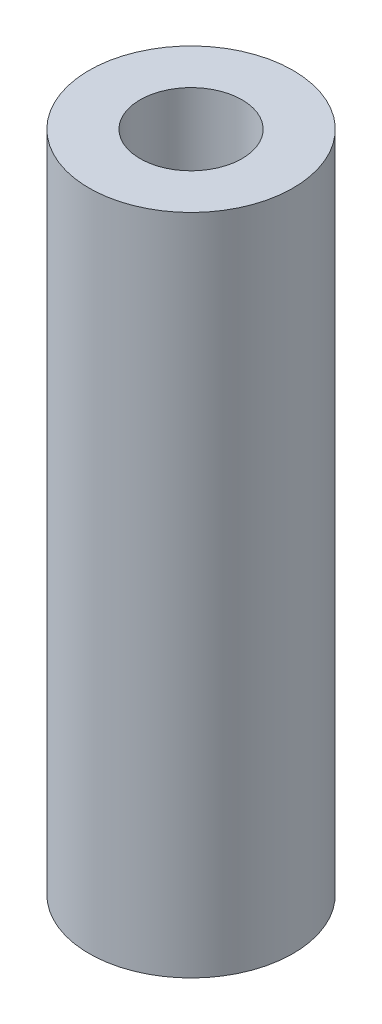
ISO-10303-21;
HEADER;
FILE_DESCRIPTION(('STEP AP214'),'2;1');
FILE_NAME('part.step','',(''),(''),'','','');
FILE_SCHEMA(('AUTOMOTIVE_DESIGN { 1 0 10303 214 1 1 1 1 }'));
ENDSEC;
DATA;
#1=APPLICATION_CONTEXT('core data for automotive mechanical design processes');
#2=APPLICATION_PROTOCOL_DEFINITION('international standard','automotive_design',2000,#1);
#3=PRODUCT_CONTEXT('',#1,'mechanical');
#4=PRODUCT('Part','Part','',(#3));
#5=PRODUCT_RELATED_PRODUCT_CATEGORY('part','',(#4));
#6=PRODUCT_DEFINITION_FORMATION('','',#4);
#7=PRODUCT_DEFINITION_CONTEXT('part definition',#1,'design');
#8=PRODUCT_DEFINITION('design','',#6,#7);
#9=PRODUCT_DEFINITION_SHAPE('','',#8);
#10=(LENGTH_UNIT() NAMED_UNIT(*) SI_UNIT(.MILLI.,.METRE.));
#11=(NAMED_UNIT(*) PLANE_ANGLE_UNIT() SI_UNIT($,.RADIAN.));
#12=(NAMED_UNIT(*) SI_UNIT($,.STERADIAN.) SOLID_ANGLE_UNIT());
#13=UNCERTAINTY_MEASURE_WITH_UNIT(LENGTH_MEASURE(1.E-05),#10,'distance_accuracy_value','');
#14=(GEOMETRIC_REPRESENTATION_CONTEXT(3) GLOBAL_UNCERTAINTY_ASSIGNED_CONTEXT((#13)) GLOBAL_UNIT_ASSIGNED_CONTEXT((#10,
#11,#12)) REPRESENTATION_CONTEXT('',''));
#15=CARTESIAN_POINT('',(0.,0.,0.));
#16=DIRECTION('',(0.,0.,1.));
#17=DIRECTION('',(1.,0.,0.));
#18=AXIS2_PLACEMENT_3D('',#15,#16,#17);
#19=CARTESIAN_POINT('',(0.,6.5,0.));
#20=DIRECTION('',(0.,1.,0.));
#21=DIRECTION('',(0.,0.,1.));
#22=AXIS2_PLACEMENT_3D('',#19,#20,#21);
#23=PLANE('',#22);
#24=CARTESIAN_POINT('',(0.,6.5,0.));
#25=DIRECTION('',(0.,1.,0.));
#26=DIRECTION('',(0.,0.,1.));
#27=AXIS2_PLACEMENT_3D('',#24,#25,#26);
#28=CIRCLE('',#27,2.);
#29=CARTESIAN_POINT('',(0.,6.5,-2.));
#30=VERTEX_POINT('',#29);
#31=EDGE_CURVE('E10',#30,#30,#28,.T.);
#32=ORIENTED_EDGE('',*,*,#31,.T.);
#33=EDGE_LOOP('',(#32));
#34=FACE_BOUND('',#33,.T.);
#35=CARTESIAN_POINT('',(0.,6.5,0.));
#36=DIRECTION('',(0.,1.,0.));
#37=DIRECTION('',(0.,0.,1.));
#38=AXIS2_PLACEMENT_3D('',#35,#36,#37);
#39=CIRCLE('',#38,1.);
#40=CARTESIAN_POINT('',(0.,6.5,-1.));
#41=VERTEX_POINT('',#40);
#42=EDGE_CURVE('E42',#41,#41,#39,.T.);
#43=ORIENTED_EDGE('',*,*,#42,.F.);
#44=EDGE_LOOP('',(#43));
#45=FACE_BOUND('',#44,.T.);
#46=ADVANCED_FACE('F31',(#34,#45),#23,.T.);
#47=CARTESIAN_POINT('',(0.,-6.5,0.));
#48=DIRECTION('',(0.,1.,0.));
#49=DIRECTION('',(0.,0.,1.));
#50=AXIS2_PLACEMENT_3D('',#47,#48,#49);
#51=PLANE('',#50);
#52=CARTESIAN_POINT('',(0.,-6.5,0.));
#53=DIRECTION('',(0.,1.,0.));
#54=DIRECTION('',(0.,0.,1.));
#55=AXIS2_PLACEMENT_3D('',#52,#53,#54);
#56=CIRCLE('',#55,2.);
#57=CARTESIAN_POINT('',(0.,-6.5,-2.));
#58=VERTEX_POINT('',#57);
#59=EDGE_CURVE('E35',#58,#58,#56,.T.);
#60=ORIENTED_EDGE('',*,*,#59,.F.);
#61=EDGE_LOOP('',(#60));
#62=FACE_BOUND('',#61,.T.);
#63=CARTESIAN_POINT('',(0.,-6.5,0.));
#64=DIRECTION('',(0.,1.,0.));
#65=DIRECTION('',(0.,0.,1.));
#66=AXIS2_PLACEMENT_3D('',#63,#64,#65);
#67=CIRCLE('',#66,1.);
#68=CARTESIAN_POINT('',(0.,-6.5,-1.));
#69=VERTEX_POINT('',#68);
#70=EDGE_CURVE('E44',#69,#69,#67,.T.);
#71=ORIENTED_EDGE('',*,*,#70,.T.);
#72=EDGE_LOOP('',(#71));
#73=FACE_BOUND('',#72,.T.);
#74=ADVANCED_FACE('F54',(#62,#73),#51,.F.);
#75=CARTESIAN_POINT('',(0.,6.5,0.));
#76=DIRECTION('',(0.,-1.,0.));
#77=DIRECTION('',(0.,0.,-1.));
#78=AXIS2_PLACEMENT_3D('',#75,#76,#77);
#79=CYLINDRICAL_SURFACE('',#78,2.);
#80=CARTESIAN_POINT('',(0.,6.5,-2.));
#81=CARTESIAN_POINT('',(0.,6.36458333333333,-2.));
#82=CARTESIAN_POINT('',(0.,6.22916666666667,-2.));
#83=CARTESIAN_POINT('',(0.,5.95833333333333,-2.));
#84=CARTESIAN_POINT('',(0.,5.82291666666667,-2.));
#85=CARTESIAN_POINT('',(0.,5.55208333333333,-2.));
#86=CARTESIAN_POINT('',(0.,5.41666666666667,-2.));
#87=CARTESIAN_POINT('',(0.,5.14583333333333,-2.));
#88=CARTESIAN_POINT('',(0.,5.01041666666667,-2.));
#89=CARTESIAN_POINT('',(0.,4.73958333333333,-2.));
#90=CARTESIAN_POINT('',(0.,4.60416666666667,-2.));
#91=CARTESIAN_POINT('',(0.,4.33333333333333,-2.));
#92=CARTESIAN_POINT('',(0.,4.19791666666667,-2.));
#93=CARTESIAN_POINT('',(0.,3.92708333333333,-2.));
#94=CARTESIAN_POINT('',(0.,3.79166666666667,-2.));
#95=CARTESIAN_POINT('',(0.,3.52083333333333,-2.));
#96=CARTESIAN_POINT('',(0.,3.38541666666667,-2.));
#97=CARTESIAN_POINT('',(0.,3.11458333333333,-2.));
#98=CARTESIAN_POINT('',(0.,2.97916666666667,-2.));
#99=CARTESIAN_POINT('',(0.,2.70833333333333,-2.));
#100=CARTESIAN_POINT('',(0.,2.57291666666667,-2.));
#101=CARTESIAN_POINT('',(0.,2.30208333333333,-2.));
#102=CARTESIAN_POINT('',(0.,2.16666666666667,-2.));
#103=CARTESIAN_POINT('',(0.,1.89583333333333,-2.));
#104=CARTESIAN_POINT('',(0.,1.76041666666667,-2.));
#105=CARTESIAN_POINT('',(0.,1.48958333333333,-2.));
#106=CARTESIAN_POINT('',(0.,1.35416666666667,-2.));
#107=CARTESIAN_POINT('',(0.,1.08333333333333,-2.));
#108=CARTESIAN_POINT('',(0.,0.947916666666666,-2.));
#109=CARTESIAN_POINT('',(0.,0.677083333333332,-2.));
#110=CARTESIAN_POINT('',(0.,0.541666666666666,-2.));
#111=CARTESIAN_POINT('',(0.,0.270833333333333,-2.));
#112=CARTESIAN_POINT('',(0.,0.135416666666666,-2.));
#113=CARTESIAN_POINT('',(0.,-0.135416666666668,-2.));
#114=CARTESIAN_POINT('',(0.,-0.270833333333334,-2.));
#115=CARTESIAN_POINT('',(0.,-0.541666666666668,-2.));
#116=CARTESIAN_POINT('',(0.,-0.677083333333334,-2.));
#117=CARTESIAN_POINT('',(0.,-0.947916666666667,-2.));
#118=CARTESIAN_POINT('',(0.,-1.08333333333333,-2.));
#119=CARTESIAN_POINT('',(0.,-1.35416666666667,-2.));
#120=CARTESIAN_POINT('',(0.,-1.48958333333333,-2.));
#121=CARTESIAN_POINT('',(0.,-1.76041666666667,-2.));
#122=CARTESIAN_POINT('',(0.,-1.89583333333333,-2.));
#123=CARTESIAN_POINT('',(0.,-2.16666666666667,-2.));
#124=CARTESIAN_POINT('',(0.,-2.30208333333333,-2.));
#125=CARTESIAN_POINT('',(0.,-2.57291666666667,-2.));
#126=CARTESIAN_POINT('',(0.,-2.70833333333333,-2.));
#127=CARTESIAN_POINT('',(0.,-2.97916666666667,-2.));
#128=CARTESIAN_POINT('',(0.,-3.11458333333333,-2.));
#129=CARTESIAN_POINT('',(0.,-3.38541666666667,-2.));
#130=CARTESIAN_POINT('',(0.,-3.52083333333333,-2.));
#131=CARTESIAN_POINT('',(0.,-3.79166666666667,-2.));
#132=CARTESIAN_POINT('',(0.,-3.92708333333333,-2.));
#133=CARTESIAN_POINT('',(0.,-4.19791666666667,-2.));
#134=CARTESIAN_POINT('',(0.,-4.33333333333333,-2.));
#135=CARTESIAN_POINT('',(0.,-4.60416666666667,-2.));
#136=CARTESIAN_POINT('',(0.,-4.73958333333333,-2.));
#137=CARTESIAN_POINT('',(0.,-5.01041666666667,-2.));
#138=CARTESIAN_POINT('',(0.,-5.14583333333333,-2.));
#139=CARTESIAN_POINT('',(0.,-5.41666666666667,-2.));
#140=CARTESIAN_POINT('',(0.,-5.55208333333333,-2.));
#141=CARTESIAN_POINT('',(0.,-5.82291666666667,-2.));
#142=CARTESIAN_POINT('',(0.,-5.95833333333333,-2.));
#143=CARTESIAN_POINT('',(0.,-6.22916666666667,-2.));
#144=CARTESIAN_POINT('',(0.,-6.36458333333333,-2.));
#145=CARTESIAN_POINT('',(0.,-6.5,-2.));
#146=B_SPLINE_CURVE_WITH_KNOTS('',3,(#80,#81,#82,#83,#84,#85,#86,#87,#88,#89,#90,#91,#92,#93,
#94,#95,#96,#97,#98,#99,#100,#101,#102,#103,#104,#105,#106,#107,#108,#109,#110,#111,#112,#113,
#114,#115,#116,#117,#118,#119,#120,#121,#122,#123,#124,#125,#126,#127,#128,#129,#130,#131,#132,
#133,#134,#135,#136,#137,#138,#139,#140,#141,#142,#143,#144,#145),.UNSPECIFIED.,.F.,.F.,(4,2,2,
2,2,2,2,2,2,2,2,2,2,2,2,2,2,2,2,2,2,2,2,2,2,2,2,2,2,2,2,2,4),(0.,0.40625,0.8125,1.21875,1.625,
2.03125,2.4375,2.84375,3.25,3.65625,4.0625,4.46875,4.875,5.28125,5.6875,6.09375,6.5,6.90625,
7.3125,7.71875,8.125,8.53125,8.9375,9.34375,9.75,10.15625,10.5625,10.96875,11.375,11.78125,
12.1875,12.59375,13.),.UNSPECIFIED.);
#147=EDGE_CURVE('BSEAM33',#30,#58,#146,.T.);
#148=ORIENTED_EDGE('',*,*,#31,.F.);
#149=ORIENTED_EDGE('',*,*,#59,.T.);
#150=ORIENTED_EDGE('',*,*,#147,.T.);
#151=ORIENTED_EDGE('',*,*,#147,.F.);
#152=EDGE_LOOP('',(#148,#150,#149,#151));
#153=FACE_BOUND('',#152,.T.);
#154=ADVANCED_FACE('F33',(#153),#79,.T.);
#155=CARTESIAN_POINT('',(0.,6.5,0.));
#156=DIRECTION('',(0.,-1.,0.));
#157=DIRECTION('',(0.,0.,-1.));
#158=AXIS2_PLACEMENT_3D('',#155,#156,#157);
#159=CYLINDRICAL_SURFACE('',#158,1.);
#160=CARTESIAN_POINT('',(0.,6.5,-1.));
#161=CARTESIAN_POINT('',(0.,6.36458333333333,-1.));
#162=CARTESIAN_POINT('',(0.,6.22916666666667,-1.));
#163=CARTESIAN_POINT('',(0.,5.95833333333333,-1.));
#164=CARTESIAN_POINT('',(0.,5.82291666666667,-1.));
#165=CARTESIAN_POINT('',(0.,5.55208333333333,-1.));
#166=CARTESIAN_POINT('',(0.,5.41666666666667,-1.));
#167=CARTESIAN_POINT('',(0.,5.14583333333333,-1.));
#168=CARTESIAN_POINT('',(0.,5.01041666666667,-1.));
#169=CARTESIAN_POINT('',(0.,4.73958333333333,-1.));
#170=CARTESIAN_POINT('',(0.,4.60416666666667,-1.));
#171=CARTESIAN_POINT('',(0.,4.33333333333333,-1.));
#172=CARTESIAN_POINT('',(0.,4.19791666666667,-1.));
#173=CARTESIAN_POINT('',(0.,3.92708333333333,-1.));
#174=CARTESIAN_POINT('',(0.,3.79166666666667,-1.));
#175=CARTESIAN_POINT('',(0.,3.52083333333333,-1.));
#176=CARTESIAN_POINT('',(0.,3.38541666666667,-1.));
#177=CARTESIAN_POINT('',(0.,3.11458333333333,-1.));
#178=CARTESIAN_POINT('',(0.,2.97916666666667,-1.));
#179=CARTESIAN_POINT('',(0.,2.70833333333333,-1.));
#180=CARTESIAN_POINT('',(0.,2.57291666666667,-1.));
#181=CARTESIAN_POINT('',(0.,2.30208333333333,-1.));
#182=CARTESIAN_POINT('',(0.,2.16666666666667,-1.));
#183=CARTESIAN_POINT('',(0.,1.89583333333333,-1.));
#184=CARTESIAN_POINT('',(0.,1.76041666666667,-1.));
#185=CARTESIAN_POINT('',(0.,1.48958333333333,-1.));
#186=CARTESIAN_POINT('',(0.,1.35416666666667,-1.));
#187=CARTESIAN_POINT('',(0.,1.08333333333333,-1.));
#188=CARTESIAN_POINT('',(0.,0.947916666666666,-1.));
#189=CARTESIAN_POINT('',(0.,0.677083333333332,-1.));
#190=CARTESIAN_POINT('',(0.,0.541666666666666,-1.));
#191=CARTESIAN_POINT('',(0.,0.270833333333333,-1.));
#192=CARTESIAN_POINT('',(0.,0.135416666666666,-1.));
#193=CARTESIAN_POINT('',(0.,-0.135416666666668,-1.));
#194=CARTESIAN_POINT('',(0.,-0.270833333333334,-1.));
#195=CARTESIAN_POINT('',(0.,-0.541666666666668,-1.));
#196=CARTESIAN_POINT('',(0.,-0.677083333333334,-1.));
#197=CARTESIAN_POINT('',(0.,-0.947916666666667,-1.));
#198=CARTESIAN_POINT('',(0.,-1.08333333333333,-1.));
#199=CARTESIAN_POINT('',(0.,-1.35416666666667,-1.));
#200=CARTESIAN_POINT('',(0.,-1.48958333333333,-1.));
#201=CARTESIAN_POINT('',(0.,-1.76041666666667,-1.));
#202=CARTESIAN_POINT('',(0.,-1.89583333333333,-1.));
#203=CARTESIAN_POINT('',(0.,-2.16666666666667,-1.));
#204=CARTESIAN_POINT('',(0.,-2.30208333333333,-1.));
#205=CARTESIAN_POINT('',(0.,-2.57291666666667,-1.));
#206=CARTESIAN_POINT('',(0.,-2.70833333333333,-1.));
#207=CARTESIAN_POINT('',(0.,-2.97916666666667,-1.));
#208=CARTESIAN_POINT('',(0.,-3.11458333333333,-1.));
#209=CARTESIAN_POINT('',(0.,-3.38541666666667,-1.));
#210=CARTESIAN_POINT('',(0.,-3.52083333333333,-1.));
#211=CARTESIAN_POINT('',(0.,-3.79166666666667,-1.));
#212=CARTESIAN_POINT('',(0.,-3.92708333333333,-1.));
#213=CARTESIAN_POINT('',(0.,-4.19791666666667,-1.));
#214=CARTESIAN_POINT('',(0.,-4.33333333333333,-1.));
#215=CARTESIAN_POINT('',(0.,-4.60416666666667,-1.));
#216=CARTESIAN_POINT('',(0.,-4.73958333333333,-1.));
#217=CARTESIAN_POINT('',(0.,-5.01041666666667,-1.));
#218=CARTESIAN_POINT('',(0.,-5.14583333333333,-1.));
#219=CARTESIAN_POINT('',(0.,-5.41666666666667,-1.));
#220=CARTESIAN_POINT('',(0.,-5.55208333333333,-1.));
#221=CARTESIAN_POINT('',(0.,-5.82291666666667,-1.));
#222=CARTESIAN_POINT('',(0.,-5.95833333333333,-1.));
#223=CARTESIAN_POINT('',(0.,-6.22916666666667,-1.));
#224=CARTESIAN_POINT('',(0.,-6.36458333333333,-1.));
#225=CARTESIAN_POINT('',(0.,-6.5,-1.));
#226=B_SPLINE_CURVE_WITH_KNOTS('',3,(#160,#161,#162,#163,#164,#165,#166,#167,#168,#169,#170,
#171,#172,#173,#174,#175,#176,#177,#178,#179,#180,#181,#182,#183,#184,#185,#186,#187,#188,#189,
#190,#191,#192,#193,#194,#195,#196,#197,#198,#199,#200,#201,#202,#203,#204,#205,#206,#207,#208,
#209,#210,#211,#212,#213,#214,#215,#216,#217,#218,#219,#220,#221,#222,#223,#224,#225),
.UNSPECIFIED.,.F.,.F.,(4,2,2,2,2,2,2,2,2,2,2,2,2,2,2,2,2,2,2,2,2,2,2,2,2,2,2,2,2,2,2,2,4),(0.,
0.40625,0.8125,1.21875,1.625,2.03125,2.4375,2.84375,3.25,3.65625,4.0625,4.46875,4.875,5.28125,
5.6875,6.09375,6.5,6.90625,7.3125,7.71875,8.125,8.53125,8.9375,9.34375,9.75,10.15625,10.5625,
10.96875,11.375,11.78125,12.1875,12.59375,13.),.UNSPECIFIED.);
#227=EDGE_CURVE('BSEAM50',#41,#69,#226,.T.);
#228=ORIENTED_EDGE('',*,*,#42,.T.);
#229=ORIENTED_EDGE('',*,*,#70,.F.);
#230=ORIENTED_EDGE('',*,*,#227,.T.);
#231=ORIENTED_EDGE('',*,*,#227,.F.);
#232=EDGE_LOOP('',(#228,#230,#229,#231));
#233=FACE_BOUND('',#232,.T.);
#234=ADVANCED_FACE('F50',(#233),#159,.F.);
#235=CLOSED_SHELL('',(#46,#74,#154,#234));
#236=MANIFOLD_SOLID_BREP('B2',#235);
#237=ADVANCED_BREP_SHAPE_REPRESENTATION('',(#18,#236),#14);
#238=SHAPE_DEFINITION_REPRESENTATION(#9,#237);
ENDSEC;
END-ISO-10303-21;
